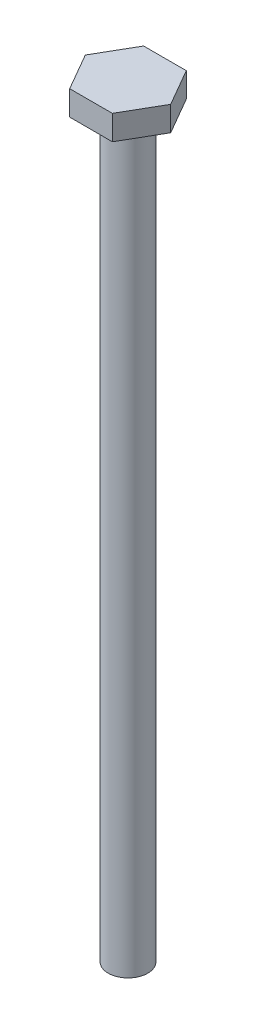
ISO-10303-21;
HEADER;
FILE_DESCRIPTION(('STEP AP214'),'2;1');
FILE_NAME('part.step','',(''),(''),'','','');
FILE_SCHEMA(('AUTOMOTIVE_DESIGN { 1 0 10303 214 1 1 1 1 }'));
ENDSEC;
DATA;
#1=APPLICATION_CONTEXT('core data for automotive mechanical design processes');
#2=APPLICATION_PROTOCOL_DEFINITION('international standard','automotive_design',2000,#1);
#3=PRODUCT_CONTEXT('',#1,'mechanical');
#4=PRODUCT('Part','Part','',(#3));
#5=PRODUCT_RELATED_PRODUCT_CATEGORY('part','',(#4));
#6=PRODUCT_DEFINITION_FORMATION('','',#4);
#7=PRODUCT_DEFINITION_CONTEXT('part definition',#1,'design');
#8=PRODUCT_DEFINITION('design','',#6,#7);
#9=PRODUCT_DEFINITION_SHAPE('','',#8);
#10=(LENGTH_UNIT() NAMED_UNIT(*) SI_UNIT(.MILLI.,.METRE.));
#11=(NAMED_UNIT(*) PLANE_ANGLE_UNIT() SI_UNIT($,.RADIAN.));
#12=(NAMED_UNIT(*) SI_UNIT($,.STERADIAN.) SOLID_ANGLE_UNIT());
#13=UNCERTAINTY_MEASURE_WITH_UNIT(LENGTH_MEASURE(1.E-05),#10,'distance_accuracy_value','');
#14=(GEOMETRIC_REPRESENTATION_CONTEXT(3) GLOBAL_UNCERTAINTY_ASSIGNED_CONTEXT((#13)) GLOBAL_UNIT_ASSIGNED_CONTEXT((#10,
#11,#12)) REPRESENTATION_CONTEXT('',''));
#15=CARTESIAN_POINT('',(0.,0.,0.));
#16=DIRECTION('',(0.,0.,1.));
#17=DIRECTION('',(1.,0.,0.));
#18=AXIS2_PLACEMENT_3D('',#15,#16,#17);
#19=CARTESIAN_POINT('',(2.16506350946113,2.5,3.74999999999996));
#20=DIRECTION('',(-0.866025403784442,0.,-0.499999999999995));
#21=DIRECTION('',(-0.499999999999995,0.,0.866025403784442));
#22=AXIS2_PLACEMENT_3D('',#19,#20,#21);
#23=PLANE('',#22);
#24=DIRECTION('',(0.499999999999995,0.,-0.866025403784442));
#25=VECTOR('',#24,1.);
#26=CARTESIAN_POINT('',(2.16506350946113,0.,3.74999999999996));
#27=LINE('',#26,#25);
#28=CARTESIAN_POINT('',(2.16506350946113,0.,3.74999999999996));
#29=VERTEX_POINT('',#28);
#30=CARTESIAN_POINT('',(4.33012701892218,0.,0.));
#31=VERTEX_POINT('',#30);
#32=EDGE_CURVE('E121',#29,#31,#27,.T.);
#33=ORIENTED_EDGE('',*,*,#32,.T.);
#34=DIRECTION('',(0.,-1.,0.));
#35=VECTOR('',#34,1.);
#36=CARTESIAN_POINT('',(4.33012701892218,2.5,0.));
#37=LINE('',#36,#35);
#38=CARTESIAN_POINT('',(4.33012701892218,2.5,0.));
#39=VERTEX_POINT('',#38);
#40=EDGE_CURVE('E38',#39,#31,#37,.T.);
#41=ORIENTED_EDGE('',*,*,#40,.F.);
#42=DIRECTION('',(0.499999999999995,0.,-0.866025403784442));
#43=VECTOR('',#42,1.);
#44=CARTESIAN_POINT('',(2.16506350946113,2.5,3.74999999999996));
#45=LINE('',#44,#43);
#46=CARTESIAN_POINT('',(2.16506350946113,2.5,3.74999999999996));
#47=VERTEX_POINT('',#46);
#48=EDGE_CURVE('E132',#47,#39,#45,.T.);
#49=ORIENTED_EDGE('',*,*,#48,.F.);
#50=DIRECTION('',(0.,-1.,0.));
#51=VECTOR('',#50,1.);
#52=CARTESIAN_POINT('',(2.16506350946113,2.5,3.74999999999996));
#53=LINE('',#52,#51);
#54=EDGE_CURVE('E117',#47,#29,#53,.T.);
#55=ORIENTED_EDGE('',*,*,#54,.T.);
#56=EDGE_LOOP('',(#33,#41,#49,#55));
#57=FACE_BOUND('',#56,.T.);
#58=ADVANCED_FACE('F35',(#57),#23,.F.);
#59=CARTESIAN_POINT('',(4.33012701892218,2.5,0.));
#60=DIRECTION('',(-0.866025403784438,0.,0.500000000000001));
#61=DIRECTION('',(0.500000000000001,0.,0.866025403784438));
#62=AXIS2_PLACEMENT_3D('',#59,#60,#61);
#63=PLANE('',#62);
#64=DIRECTION('',(-0.500000000000001,0.,-0.866025403784438));
#65=VECTOR('',#64,1.);
#66=CARTESIAN_POINT('',(4.33012701892218,0.,0.));
#67=LINE('',#66,#65);
#68=CARTESIAN_POINT('',(2.16506350946108,0.,-3.74999999999999));
#69=VERTEX_POINT('',#68);
#70=EDGE_CURVE('E124',#31,#69,#67,.T.);
#71=ORIENTED_EDGE('',*,*,#70,.T.);
#72=DIRECTION('',(0.,-1.,0.));
#73=VECTOR('',#72,1.);
#74=CARTESIAN_POINT('',(2.16506350946108,2.5,-3.74999999999999));
#75=LINE('',#74,#73);
#76=CARTESIAN_POINT('',(2.16506350946108,2.5,-3.74999999999999));
#77=VERTEX_POINT('',#76);
#78=EDGE_CURVE('E135',#77,#69,#75,.T.);
#79=ORIENTED_EDGE('',*,*,#78,.F.);
#80=DIRECTION('',(-0.500000000000001,0.,-0.866025403784438));
#81=VECTOR('',#80,1.);
#82=CARTESIAN_POINT('',(4.33012701892218,2.5,0.));
#83=LINE('',#82,#81);
#84=EDGE_CURVE('E90',#39,#77,#83,.T.);
#85=ORIENTED_EDGE('',*,*,#84,.F.);
#86=ORIENTED_EDGE('',*,*,#40,.T.);
#87=EDGE_LOOP('',(#71,#79,#85,#86));
#88=FACE_BOUND('',#87,.T.);
#89=ADVANCED_FACE('F140',(#88),#63,.F.);
#90=CARTESIAN_POINT('',(2.16506350946108,2.5,-3.74999999999999));
#91=DIRECTION('',(0.,0.,1.));
#92=DIRECTION('',(1.,0.,0.));
#93=AXIS2_PLACEMENT_3D('',#90,#91,#92);
#94=PLANE('',#93);
#95=DIRECTION('',(-1.,0.,0.));
#96=VECTOR('',#95,1.);
#97=CARTESIAN_POINT('',(2.16506350946108,0.,-3.74999999999999));
#98=LINE('',#97,#96);
#99=CARTESIAN_POINT('',(-2.16506350946111,0.,-3.74999999999998));
#100=VERTEX_POINT('',#99);
#101=EDGE_CURVE('E127',#69,#100,#98,.T.);
#102=ORIENTED_EDGE('',*,*,#101,.T.);
#103=DIRECTION('',(0.,-1.,0.));
#104=VECTOR('',#103,1.);
#105=CARTESIAN_POINT('',(-2.16506350946111,2.5,-3.74999999999998));
#106=LINE('',#105,#104);
#107=CARTESIAN_POINT('',(-2.16506350946111,2.5,-3.74999999999998));
#108=VERTEX_POINT('',#107);
#109=EDGE_CURVE('E112',#108,#100,#106,.T.);
#110=ORIENTED_EDGE('',*,*,#109,.F.);
#111=DIRECTION('',(-1.,0.,0.));
#112=VECTOR('',#111,1.);
#113=CARTESIAN_POINT('',(2.16506350946108,2.5,-3.74999999999999));
#114=LINE('',#113,#112);
#115=EDGE_CURVE('E103',#77,#108,#114,.T.);
#116=ORIENTED_EDGE('',*,*,#115,.F.);
#117=ORIENTED_EDGE('',*,*,#78,.T.);
#118=EDGE_LOOP('',(#102,#110,#116,#117));
#119=FACE_BOUND('',#118,.T.);
#120=ADVANCED_FACE('F146',(#119),#94,.F.);
#121=CARTESIAN_POINT('',(-2.16506350946111,2.5,-3.74999999999998));
#122=DIRECTION('',(0.866025403784442,0.,0.499999999999995));
#123=DIRECTION('',(0.499999999999995,0.,-0.866025403784442));
#124=AXIS2_PLACEMENT_3D('',#121,#122,#123);
#125=PLANE('',#124);
#126=DIRECTION('',(-0.499999999999995,0.,0.866025403784442));
#127=VECTOR('',#126,1.);
#128=CARTESIAN_POINT('',(-2.16506350946111,0.,-3.74999999999998));
#129=LINE('',#128,#127);
#130=CARTESIAN_POINT('',(-4.33012701892218,0.,0.));
#131=VERTEX_POINT('',#130);
#132=EDGE_CURVE('E111',#100,#131,#129,.T.);
#133=ORIENTED_EDGE('',*,*,#132,.T.);
#134=DIRECTION('',(0.,-1.,0.));
#135=VECTOR('',#134,1.);
#136=CARTESIAN_POINT('',(-4.33012701892218,2.5,0.));
#137=LINE('',#136,#135);
#138=CARTESIAN_POINT('',(-4.33012701892218,2.5,0.));
#139=VERTEX_POINT('',#138);
#140=EDGE_CURVE('E108',#139,#131,#137,.T.);
#141=ORIENTED_EDGE('',*,*,#140,.F.);
#142=DIRECTION('',(-0.499999999999995,0.,0.866025403784442));
#143=VECTOR('',#142,1.);
#144=CARTESIAN_POINT('',(-2.16506350946111,2.5,-3.74999999999998));
#145=LINE('',#144,#143);
#146=EDGE_CURVE('E97',#108,#139,#145,.T.);
#147=ORIENTED_EDGE('',*,*,#146,.F.);
#148=ORIENTED_EDGE('',*,*,#109,.T.);
#149=EDGE_LOOP('',(#133,#141,#147,#148));
#150=FACE_BOUND('',#149,.T.);
#151=ADVANCED_FACE('F109',(#150),#125,.F.);
#152=CARTESIAN_POINT('',(-4.33012701892218,2.5,0.));
#153=DIRECTION('',(0.866025403784435,0.,-0.500000000000007));
#154=DIRECTION('',(-0.500000000000007,0.,-0.866025403784435));
#155=AXIS2_PLACEMENT_3D('',#152,#153,#154);
#156=PLANE('',#155);
#157=DIRECTION('',(0.500000000000007,0.,0.866025403784435));
#158=VECTOR('',#157,1.);
#159=CARTESIAN_POINT('',(-4.33012701892218,0.,0.));
#160=LINE('',#159,#158);
#161=CARTESIAN_POINT('',(-2.16506350946105,0.,3.75000000000001));
#162=VERTEX_POINT('',#161);
#163=EDGE_CURVE('E75',#131,#162,#160,.T.);
#164=ORIENTED_EDGE('',*,*,#163,.T.);
#165=DIRECTION('',(0.,-1.,0.));
#166=VECTOR('',#165,1.);
#167=CARTESIAN_POINT('',(-2.16506350946105,2.5,3.75000000000001));
#168=LINE('',#167,#166);
#169=CARTESIAN_POINT('',(-2.16506350946105,2.5,3.75000000000001));
#170=VERTEX_POINT('',#169);
#171=EDGE_CURVE('E113',#170,#162,#168,.T.);
#172=ORIENTED_EDGE('',*,*,#171,.F.);
#173=DIRECTION('',(0.500000000000007,0.,0.866025403784435));
#174=VECTOR('',#173,1.);
#175=CARTESIAN_POINT('',(-4.33012701892218,2.5,0.));
#176=LINE('',#175,#174);
#177=EDGE_CURVE('E101',#139,#170,#176,.T.);
#178=ORIENTED_EDGE('',*,*,#177,.F.);
#179=ORIENTED_EDGE('',*,*,#140,.T.);
#180=EDGE_LOOP('',(#164,#172,#178,#179));
#181=FACE_BOUND('',#180,.T.);
#182=ADVANCED_FACE('F115',(#181),#156,.F.);
#183=CARTESIAN_POINT('',(-2.16506350946105,2.5,3.75000000000001));
#184=DIRECTION('',(0.,0.,-1.));
#185=DIRECTION('',(-1.,0.,0.));
#186=AXIS2_PLACEMENT_3D('',#183,#184,#185);
#187=PLANE('',#186);
#188=DIRECTION('',(1.,0.,0.));
#189=VECTOR('',#188,1.);
#190=CARTESIAN_POINT('',(-2.16506350946105,0.,3.75000000000001));
#191=LINE('',#190,#189);
#192=EDGE_CURVE('E81',#162,#29,#191,.T.);
#193=ORIENTED_EDGE('',*,*,#192,.T.);
#194=ORIENTED_EDGE('',*,*,#54,.F.);
#195=DIRECTION('',(1.,0.,0.));
#196=VECTOR('',#195,1.);
#197=CARTESIAN_POINT('',(-2.16506350946105,2.5,3.75000000000001));
#198=LINE('',#197,#196);
#199=EDGE_CURVE('E52',#170,#47,#198,.T.);
#200=ORIENTED_EDGE('',*,*,#199,.F.);
#201=ORIENTED_EDGE('',*,*,#171,.T.);
#202=EDGE_LOOP('',(#193,#194,#200,#201));
#203=FACE_BOUND('',#202,.T.);
#204=ADVANCED_FACE('F166',(#203),#187,.F.);
#205=CARTESIAN_POINT('',(0.,2.5,0.));
#206=DIRECTION('',(0.,1.,0.));
#207=DIRECTION('',(0.,0.,1.));
#208=AXIS2_PLACEMENT_3D('',#205,#206,#207);
#209=PLANE('',#208);
#210=ORIENTED_EDGE('',*,*,#48,.T.);
#211=ORIENTED_EDGE('',*,*,#84,.T.);
#212=ORIENTED_EDGE('',*,*,#115,.T.);
#213=ORIENTED_EDGE('',*,*,#146,.T.);
#214=ORIENTED_EDGE('',*,*,#177,.T.);
#215=ORIENTED_EDGE('',*,*,#199,.T.);
#216=EDGE_LOOP('',(#210,#211,#212,#213,#214,#215));
#217=FACE_BOUND('',#216,.T.);
#218=ADVANCED_FACE('F99',(#217),#209,.T.);
#219=CARTESIAN_POINT('',(0.,0.,0.));
#220=DIRECTION('',(0.,1.,0.));
#221=DIRECTION('',(0.,0.,1.));
#222=AXIS2_PLACEMENT_3D('',#219,#220,#221);
#223=PLANE('',#222);
#224=CARTESIAN_POINT('',(0.,0.,0.));
#225=DIRECTION('',(0.,-1.,0.));
#226=DIRECTION('',(0.,0.,-1.));
#227=AXIS2_PLACEMENT_3D('',#224,#225,#226);
#228=CIRCLE('',#227,2.);
#229=CARTESIAN_POINT('',(0.,0.,-2.));
#230=VERTEX_POINT('',#229);
#231=EDGE_CURVE('E11',#230,#230,#228,.T.);
#232=ORIENTED_EDGE('',*,*,#231,.F.);
#233=EDGE_LOOP('',(#232));
#234=FACE_BOUND('',#233,.T.);
#235=ORIENTED_EDGE('',*,*,#32,.F.);
#236=ORIENTED_EDGE('',*,*,#192,.F.);
#237=ORIENTED_EDGE('',*,*,#163,.F.);
#238=ORIENTED_EDGE('',*,*,#132,.F.);
#239=ORIENTED_EDGE('',*,*,#101,.F.);
#240=ORIENTED_EDGE('',*,*,#70,.F.);
#241=EDGE_LOOP('',(#235,#236,#237,#238,#239,#240));
#242=FACE_BOUND('',#241,.T.);
#243=ADVANCED_FACE('F145',(#234,#242),#223,.F.);
#244=CARTESIAN_POINT('',(0.,-75.,0.));
#245=DIRECTION('',(0.,1.,0.));
#246=DIRECTION('',(0.,0.,1.));
#247=AXIS2_PLACEMENT_3D('',#244,#245,#246);
#248=CYLINDRICAL_SURFACE('',#247,2.);
#249=CARTESIAN_POINT('',(0.,-75.,0.));
#250=DIRECTION('',(0.,-1.,0.));
#251=DIRECTION('',(0.,0.,-1.));
#252=AXIS2_PLACEMENT_3D('',#249,#250,#251);
#253=CIRCLE('',#252,2.);
#254=CARTESIAN_POINT('',(0.,-75.,-2.));
#255=VERTEX_POINT('',#254);
#256=EDGE_CURVE('E125',#255,#255,#253,.T.);
#257=ORIENTED_EDGE('',*,*,#256,.F.);
#258=EDGE_LOOP('',(#257));
#259=FACE_BOUND('',#258,.T.);
#260=ORIENTED_EDGE('',*,*,#231,.T.);
#261=EDGE_LOOP('',(#260));
#262=FACE_BOUND('',#261,.T.);
#263=ADVANCED_FACE('F155',(#259,#262),#248,.T.);
#264=CARTESIAN_POINT('',(0.,-75.,0.));
#265=DIRECTION('',(0.,-1.,0.));
#266=DIRECTION('',(0.,0.,-1.));
#267=AXIS2_PLACEMENT_3D('',#264,#265,#266);
#268=PLANE('',#267);
#269=ORIENTED_EDGE('',*,*,#256,.T.);
#270=EDGE_LOOP('',(#269));
#271=FACE_BOUND('',#270,.T.);
#272=ADVANCED_FACE('F153',(#271),#268,.T.);
#273=CLOSED_SHELL('',(#58,#89,#120,#151,#182,#204,#218,#243,#263,#272));
#274=MANIFOLD_SOLID_BREP('B2',#273);
#275=ADVANCED_BREP_SHAPE_REPRESENTATION('',(#18,#274),#14);
#276=SHAPE_DEFINITION_REPRESENTATION(#9,#275);
ENDSEC;
END-ISO-10303-21;
